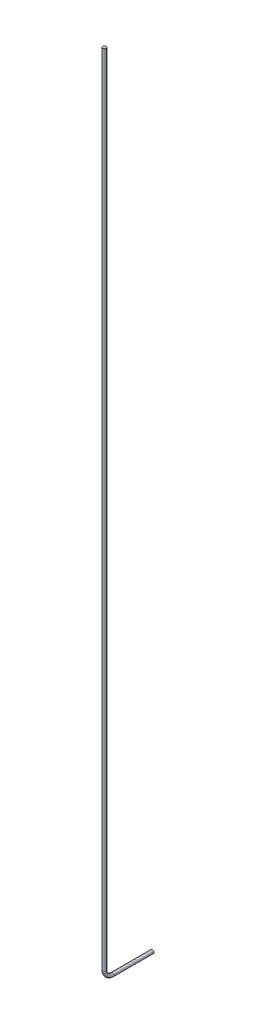
ISO-10303-21;
HEADER;
FILE_DESCRIPTION(('STEP AP214'),'2;1');
FILE_NAME('part.step','',(''),(''),'','','');
FILE_SCHEMA(('AUTOMOTIVE_DESIGN { 1 0 10303 214 1 1 1 1 }'));
ENDSEC;
DATA;
#1=APPLICATION_CONTEXT('core data for automotive mechanical design processes');
#2=APPLICATION_PROTOCOL_DEFINITION('international standard','automotive_design',2000,#1);
#3=PRODUCT_CONTEXT('',#1,'mechanical');
#4=PRODUCT('Part','Part','',(#3));
#5=PRODUCT_RELATED_PRODUCT_CATEGORY('part','',(#4));
#6=PRODUCT_DEFINITION_FORMATION('','',#4);
#7=PRODUCT_DEFINITION_CONTEXT('part definition',#1,'design');
#8=PRODUCT_DEFINITION('design','',#6,#7);
#9=PRODUCT_DEFINITION_SHAPE('','',#8);
#10=(LENGTH_UNIT() NAMED_UNIT(*) SI_UNIT(.MILLI.,.METRE.));
#11=(NAMED_UNIT(*) PLANE_ANGLE_UNIT() SI_UNIT($,.RADIAN.));
#12=(NAMED_UNIT(*) SI_UNIT($,.STERADIAN.) SOLID_ANGLE_UNIT());
#13=UNCERTAINTY_MEASURE_WITH_UNIT(LENGTH_MEASURE(1.E-05),#10,'distance_accuracy_value','');
#14=(GEOMETRIC_REPRESENTATION_CONTEXT(3) GLOBAL_UNCERTAINTY_ASSIGNED_CONTEXT((#13)) GLOBAL_UNIT_ASSIGNED_CONTEXT((#10,
#11,#12)) REPRESENTATION_CONTEXT('',''));
#15=CARTESIAN_POINT('',(0.,0.,0.));
#16=DIRECTION('',(0.,0.,1.));
#17=DIRECTION('',(1.,0.,0.));
#18=AXIS2_PLACEMENT_3D('',#15,#16,#17);
#19=CARTESIAN_POINT('',(0.,0.,20.));
#20=DIRECTION('',(0.,0.,-1.));
#21=DIRECTION('',(-1.,0.,0.));
#22=AXIS2_PLACEMENT_3D('',#19,#20,#21);
#23=CYLINDRICAL_SURFACE('',#22,1.06);
#24=CARTESIAN_POINT('',(0.,0.,0.));
#25=DIRECTION('',(0.,0.,1.));
#26=DIRECTION('',(1.,0.,0.));
#27=AXIS2_PLACEMENT_3D('',#24,#25,#26);
#28=CIRCLE('',#27,1.06);
#29=CARTESIAN_POINT('',(1.06,0.,0.));
#30=VERTEX_POINT('',#29);
#31=EDGE_CURVE('E10',#30,#30,#28,.T.);
#32=ORIENTED_EDGE('',*,*,#31,.T.);
#33=EDGE_LOOP('',(#32));
#34=FACE_BOUND('',#33,.T.);
#35=CARTESIAN_POINT('',(0.,0.,25.));
#36=DIRECTION('',(0.,0.,1.));
#37=DIRECTION('',(1.,0.,0.));
#38=AXIS2_PLACEMENT_3D('',#35,#36,#37);
#39=CIRCLE('',#38,1.06);
#40=CARTESIAN_POINT('',(0.,-1.05999999999984,25.));
#41=VERTEX_POINT('',#40);
#42=EDGE_CURVE('E56',#41,#41,#39,.T.);
#43=ORIENTED_EDGE('',*,*,#42,.F.);
#44=EDGE_LOOP('',(#43));
#45=FACE_BOUND('',#44,.T.);
#46=ADVANCED_FACE('F39',(#34,#45),#23,.T.);
#47=CARTESIAN_POINT('',(0.,0.,0.));
#48=DIRECTION('',(0.,0.,1.));
#49=DIRECTION('',(1.,0.,0.));
#50=AXIS2_PLACEMENT_3D('',#47,#48,#49);
#51=PLANE('',#50);
#52=ORIENTED_EDGE('',*,*,#31,.F.);
#53=EDGE_LOOP('',(#52));
#54=FACE_BOUND('',#53,.T.);
#55=ADVANCED_FACE('F66',(#54),#51,.F.);
#56=CARTESIAN_POINT('',(0.,505.,30.));
#57=DIRECTION('',(0.,1.,0.));
#58=DIRECTION('',(1.,0.,0.));
#59=AXIS2_PLACEMENT_3D('',#56,#57,#58);
#60=PLANE('',#59);
#61=CARTESIAN_POINT('',(0.,505.,30.));
#62=DIRECTION('',(0.,1.,0.));
#63=DIRECTION('',(1.,0.,0.));
#64=AXIS2_PLACEMENT_3D('',#61,#62,#63);
#65=CIRCLE('',#64,1.06);
#66=CARTESIAN_POINT('',(1.06,505.,30.));
#67=VERTEX_POINT('',#66);
#68=EDGE_CURVE('E46',#67,#67,#65,.T.);
#69=ORIENTED_EDGE('',*,*,#68,.T.);
#70=EDGE_LOOP('',(#69));
#71=FACE_BOUND('',#70,.T.);
#72=ADVANCED_FACE('F70',(#71),#60,.T.);
#73=CARTESIAN_POINT('',(0.,5.,25.));
#74=DIRECTION('',(-1.,0.,0.));
#75=DIRECTION('',(0.,0.,1.));
#76=AXIS2_PLACEMENT_3D('',#73,#74,#75);
#77=TOROIDAL_SURFACE('',#76,4.99999999999984,1.06);
#78=CARTESIAN_POINT('',(0.,5.,30.));
#79=DIRECTION('',(0.,1.,0.));
#80=DIRECTION('',(1.,0.,0.));
#81=AXIS2_PLACEMENT_3D('',#78,#79,#80);
#82=CIRCLE('',#81,1.06);
#83=CARTESIAN_POINT('',(0.,5.,31.0599999999998));
#84=VERTEX_POINT('',#83);
#85=EDGE_CURVE('E51',#84,#84,#82,.T.);
#86=CARTESIAN_POINT('',(0.,5.,25.));
#87=DIRECTION('',(-1.,0.,0.));
#88=DIRECTION('',(0.,0.,1.));
#89=AXIS2_PLACEMENT_3D('',#86,#87,#88);
#90=CIRCLE('',#89,6.05999999999984);
#91=EDGE_CURVE('',#41,#84,#90,.T.);
#92=ORIENTED_EDGE('',*,*,#42,.T.);
#93=ORIENTED_EDGE('',*,*,#85,.F.);
#94=ORIENTED_EDGE('',*,*,#91,.T.);
#95=ORIENTED_EDGE('',*,*,#91,.F.);
#96=EDGE_LOOP('',(#92,#94,#93,#95));
#97=FACE_BOUND('',#96,.T.);
#98=ADVANCED_FACE('F63',(#97),#77,.T.);
#99=CARTESIAN_POINT('',(0.,5.,30.));
#100=DIRECTION('',(0.,1.,0.));
#101=DIRECTION('',(0.,0.,1.));
#102=AXIS2_PLACEMENT_3D('',#99,#100,#101);
#103=CYLINDRICAL_SURFACE('',#102,1.06);
#104=ORIENTED_EDGE('',*,*,#68,.F.);
#105=EDGE_LOOP('',(#104));
#106=FACE_BOUND('',#105,.T.);
#107=ORIENTED_EDGE('',*,*,#85,.T.);
#108=EDGE_LOOP('',(#107));
#109=FACE_BOUND('',#108,.T.);
#110=ADVANCED_FACE('F72',(#106,#109),#103,.T.);
#111=CLOSED_SHELL('',(#46,#55,#72,#98,#110));
#112=MANIFOLD_SOLID_BREP('B2',#111);
#113=ADVANCED_BREP_SHAPE_REPRESENTATION('',(#18,#112),#14);
#114=SHAPE_DEFINITION_REPRESENTATION(#9,#113);
ENDSEC;
END-ISO-10303-21;
